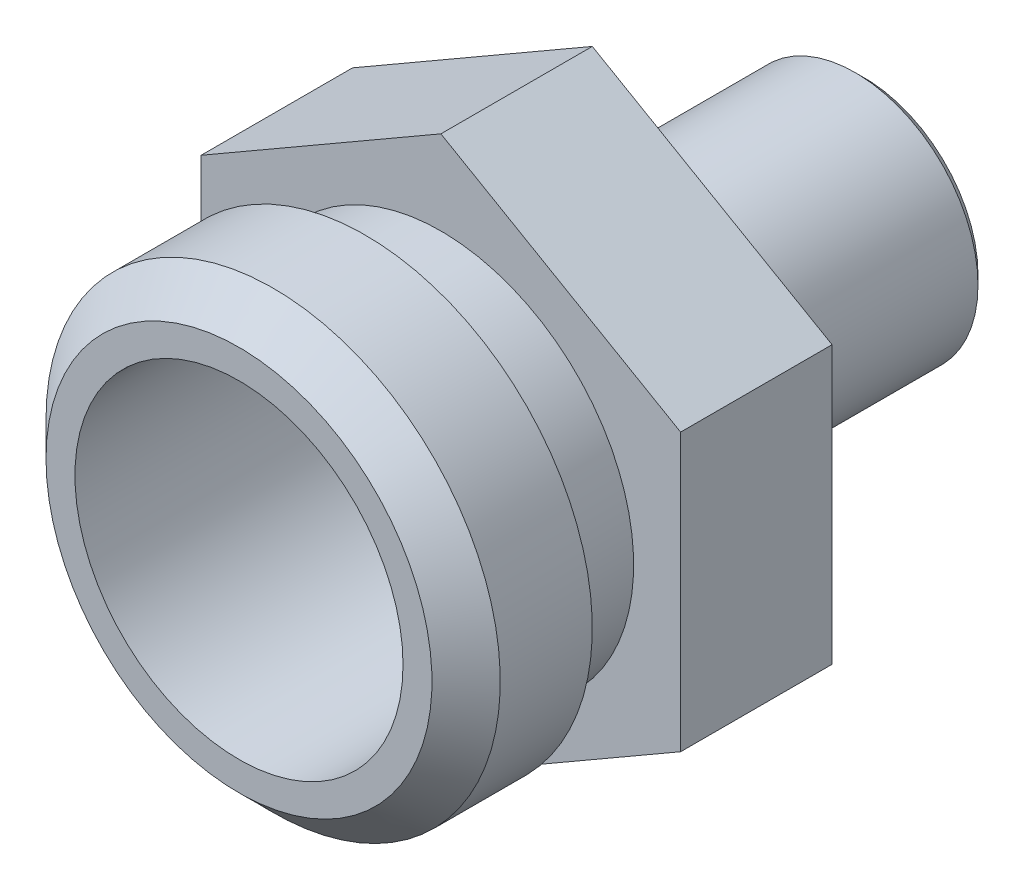
ISO-10303-21;
HEADER;
FILE_DESCRIPTION(('STEP AP214'),'2;1');
FILE_NAME('part.step','',(''),(''),'','','');
FILE_SCHEMA(('AUTOMOTIVE_DESIGN { 1 0 10303 214 1 1 1 1 }'));
ENDSEC;
DATA;
#1=APPLICATION_CONTEXT('core data for automotive mechanical design processes');
#2=APPLICATION_PROTOCOL_DEFINITION('international standard','automotive_design',2000,#1);
#3=PRODUCT_CONTEXT('',#1,'mechanical');
#4=PRODUCT('Part','Part','',(#3));
#5=PRODUCT_RELATED_PRODUCT_CATEGORY('part','',(#4));
#6=PRODUCT_DEFINITION_FORMATION('','',#4);
#7=PRODUCT_DEFINITION_CONTEXT('part definition',#1,'design');
#8=PRODUCT_DEFINITION('design','',#6,#7);
#9=PRODUCT_DEFINITION_SHAPE('','',#8);
#10=(LENGTH_UNIT() NAMED_UNIT(*) SI_UNIT(.MILLI.,.METRE.));
#11=(NAMED_UNIT(*) PLANE_ANGLE_UNIT() SI_UNIT($,.RADIAN.));
#12=(NAMED_UNIT(*) SI_UNIT($,.STERADIAN.) SOLID_ANGLE_UNIT());
#13=UNCERTAINTY_MEASURE_WITH_UNIT(LENGTH_MEASURE(1.E-05),#10,'distance_accuracy_value','');
#14=(GEOMETRIC_REPRESENTATION_CONTEXT(3) GLOBAL_UNCERTAINTY_ASSIGNED_CONTEXT((#13)) GLOBAL_UNIT_ASSIGNED_CONTEXT((#10,
#11,#12)) REPRESENTATION_CONTEXT('',''));
#15=CARTESIAN_POINT('',(0.,0.,0.));
#16=DIRECTION('',(0.,0.,1.));
#17=DIRECTION('',(1.,0.,0.));
#18=AXIS2_PLACEMENT_3D('',#15,#16,#17);
#19=CARTESIAN_POINT('',(-9.49999999999999,5.48482755730145,-14.));
#20=DIRECTION('',(0.5,-0.866025403784439,0.));
#21=DIRECTION('',(0.866025403784439,0.5,0.));
#22=AXIS2_PLACEMENT_3D('',#19,#20,#21);
#23=PLANE('',#22);
#24=DIRECTION('',(0.866025403784439,0.5,0.));
#25=VECTOR('',#24,1.);
#26=CARTESIAN_POINT('',(-9.49999999999999,5.48482755730145,-8.));
#27=LINE('',#26,#25);
#28=CARTESIAN_POINT('',(-9.49999999999999,5.48482755730145,-8.));
#29=VERTEX_POINT('',#28);
#30=CARTESIAN_POINT('',(0.,10.9696551146029,-8.));
#31=VERTEX_POINT('',#30);
#32=EDGE_CURVE('E134',#29,#31,#27,.T.);
#33=ORIENTED_EDGE('',*,*,#32,.T.);
#34=DIRECTION('',(0.,0.,1.));
#35=VECTOR('',#34,1.);
#36=CARTESIAN_POINT('',(0.,10.9696551146029,-14.));
#37=LINE('',#36,#35);
#38=CARTESIAN_POINT('',(0.,10.9696551146029,-14.));
#39=VERTEX_POINT('',#38);
#40=EDGE_CURVE('E12',#39,#31,#37,.T.);
#41=ORIENTED_EDGE('',*,*,#40,.F.);
#42=DIRECTION('',(0.866025403784439,0.5,0.));
#43=VECTOR('',#42,1.);
#44=CARTESIAN_POINT('',(-9.49999999999999,5.48482755730145,-14.));
#45=LINE('',#44,#43);
#46=CARTESIAN_POINT('',(-9.49999999999999,5.48482755730145,-14.));
#47=VERTEX_POINT('',#46);
#48=EDGE_CURVE('E145',#47,#39,#45,.T.);
#49=ORIENTED_EDGE('',*,*,#48,.F.);
#50=DIRECTION('',(0.,0.,1.));
#51=VECTOR('',#50,1.);
#52=CARTESIAN_POINT('',(-9.49999999999999,5.48482755730145,-14.));
#53=LINE('',#52,#51);
#54=EDGE_CURVE('E130',#47,#29,#53,.T.);
#55=ORIENTED_EDGE('',*,*,#54,.T.);
#56=EDGE_LOOP('',(#33,#41,#49,#55));
#57=FACE_BOUND('',#56,.T.);
#58=ADVANCED_FACE('F47',(#57),#23,.F.);
#59=CARTESIAN_POINT('',(0.,10.9696551146029,-14.));
#60=DIRECTION('',(-0.5,-0.866025403784439,0.));
#61=DIRECTION('',(0.866025403784439,-0.5,0.));
#62=AXIS2_PLACEMENT_3D('',#59,#60,#61);
#63=PLANE('',#62);
#64=DIRECTION('',(0.866025403784439,-0.5,0.));
#65=VECTOR('',#64,1.);
#66=CARTESIAN_POINT('',(0.,10.9696551146029,-8.));
#67=LINE('',#66,#65);
#68=CARTESIAN_POINT('',(9.50000000000001,5.48482755730145,-8.));
#69=VERTEX_POINT('',#68);
#70=EDGE_CURVE('E137',#31,#69,#67,.T.);
#71=ORIENTED_EDGE('',*,*,#70,.T.);
#72=DIRECTION('',(0.,0.,1.));
#73=VECTOR('',#72,1.);
#74=CARTESIAN_POINT('',(9.50000000000001,5.48482755730145,-14.));
#75=LINE('',#74,#73);
#76=CARTESIAN_POINT('',(9.50000000000001,5.48482755730145,-14.));
#77=VERTEX_POINT('',#76);
#78=EDGE_CURVE('E57',#77,#69,#75,.T.);
#79=ORIENTED_EDGE('',*,*,#78,.F.);
#80=DIRECTION('',(0.866025403784439,-0.5,0.));
#81=VECTOR('',#80,1.);
#82=CARTESIAN_POINT('',(0.,10.9696551146029,-14.));
#83=LINE('',#82,#81);
#84=EDGE_CURVE('E102',#39,#77,#83,.T.);
#85=ORIENTED_EDGE('',*,*,#84,.F.);
#86=ORIENTED_EDGE('',*,*,#40,.T.);
#87=EDGE_LOOP('',(#71,#79,#85,#86));
#88=FACE_BOUND('',#87,.T.);
#89=ADVANCED_FACE('F172',(#88),#63,.F.);
#90=CARTESIAN_POINT('',(9.50000000000001,5.48482755730145,-14.));
#91=DIRECTION('',(-1.,0.,0.));
#92=DIRECTION('',(0.,-1.,0.));
#93=AXIS2_PLACEMENT_3D('',#90,#91,#92);
#94=PLANE('',#93);
#95=DIRECTION('',(0.,-1.,0.));
#96=VECTOR('',#95,1.);
#97=CARTESIAN_POINT('',(9.50000000000001,5.48482755730145,-8.));
#98=LINE('',#97,#96);
#99=CARTESIAN_POINT('',(9.50000000000001,-5.48482755730145,-8.));
#100=VERTEX_POINT('',#99);
#101=EDGE_CURVE('E140',#69,#100,#98,.T.);
#102=ORIENTED_EDGE('',*,*,#101,.T.);
#103=DIRECTION('',(0.,0.,1.));
#104=VECTOR('',#103,1.);
#105=CARTESIAN_POINT('',(9.50000000000001,-5.48482755730145,-14.));
#106=LINE('',#105,#104);
#107=CARTESIAN_POINT('',(9.50000000000001,-5.48482755730145,-14.));
#108=VERTEX_POINT('',#107);
#109=EDGE_CURVE('E125',#108,#100,#106,.T.);
#110=ORIENTED_EDGE('',*,*,#109,.F.);
#111=DIRECTION('',(0.,-1.,0.));
#112=VECTOR('',#111,1.);
#113=CARTESIAN_POINT('',(9.50000000000001,5.48482755730145,-14.));
#114=LINE('',#113,#112);
#115=EDGE_CURVE('E116',#77,#108,#114,.T.);
#116=ORIENTED_EDGE('',*,*,#115,.F.);
#117=ORIENTED_EDGE('',*,*,#78,.T.);
#118=EDGE_LOOP('',(#102,#110,#116,#117));
#119=FACE_BOUND('',#118,.T.);
#120=ADVANCED_FACE('F152',(#119),#94,.F.);
#121=CARTESIAN_POINT('',(9.50000000000001,-5.48482755730145,-14.));
#122=DIRECTION('',(-0.5,0.866025403784438,0.));
#123=DIRECTION('',(-0.866025403784439,-0.5,0.));
#124=AXIS2_PLACEMENT_3D('',#121,#122,#123);
#125=PLANE('',#124);
#126=DIRECTION('',(-0.866025403784438,-0.5,0.));
#127=VECTOR('',#126,1.);
#128=CARTESIAN_POINT('',(9.50000000000001,-5.48482755730145,-8.));
#129=LINE('',#128,#127);
#130=CARTESIAN_POINT('',(0.,-10.9696551146029,-8.));
#131=VERTEX_POINT('',#130);
#132=EDGE_CURVE('E124',#100,#131,#129,.T.);
#133=ORIENTED_EDGE('',*,*,#132,.T.);
#134=DIRECTION('',(0.,0.,1.));
#135=VECTOR('',#134,1.);
#136=CARTESIAN_POINT('',(0.,-10.9696551146029,-14.));
#137=LINE('',#136,#135);
#138=CARTESIAN_POINT('',(0.,-10.9696551146029,-14.));
#139=VERTEX_POINT('',#138);
#140=EDGE_CURVE('E121',#139,#131,#137,.T.);
#141=ORIENTED_EDGE('',*,*,#140,.F.);
#142=DIRECTION('',(-0.866025403784438,-0.5,0.));
#143=VECTOR('',#142,1.);
#144=CARTESIAN_POINT('',(9.50000000000001,-5.48482755730145,-14.));
#145=LINE('',#144,#143);
#146=EDGE_CURVE('E109',#108,#139,#145,.T.);
#147=ORIENTED_EDGE('',*,*,#146,.F.);
#148=ORIENTED_EDGE('',*,*,#109,.T.);
#149=EDGE_LOOP('',(#133,#141,#147,#148));
#150=FACE_BOUND('',#149,.T.);
#151=ADVANCED_FACE('F122',(#150),#125,.F.);
#152=CARTESIAN_POINT('',(0.,-10.9696551146029,-14.));
#153=DIRECTION('',(0.5,0.866025403784439,0.));
#154=DIRECTION('',(-0.866025403784439,0.5,0.));
#155=AXIS2_PLACEMENT_3D('',#152,#153,#154);
#156=PLANE('',#155);
#157=DIRECTION('',(-0.866025403784439,0.5,0.));
#158=VECTOR('',#157,1.);
#159=CARTESIAN_POINT('',(0.,-10.9696551146029,-8.));
#160=LINE('',#159,#158);
#161=CARTESIAN_POINT('',(-9.49999999999999,-5.48482755730145,-8.));
#162=VERTEX_POINT('',#161);
#163=EDGE_CURVE('E88',#131,#162,#160,.T.);
#164=ORIENTED_EDGE('',*,*,#163,.T.);
#165=DIRECTION('',(0.,0.,1.));
#166=VECTOR('',#165,1.);
#167=CARTESIAN_POINT('',(-9.49999999999999,-5.48482755730145,-14.));
#168=LINE('',#167,#166);
#169=CARTESIAN_POINT('',(-9.49999999999999,-5.48482755730145,-14.));
#170=VERTEX_POINT('',#169);
#171=EDGE_CURVE('E126',#170,#162,#168,.T.);
#172=ORIENTED_EDGE('',*,*,#171,.F.);
#173=DIRECTION('',(-0.866025403784439,0.5,0.));
#174=VECTOR('',#173,1.);
#175=CARTESIAN_POINT('',(0.,-10.9696551146029,-14.));
#176=LINE('',#175,#174);
#177=EDGE_CURVE('E114',#139,#170,#176,.T.);
#178=ORIENTED_EDGE('',*,*,#177,.F.);
#179=ORIENTED_EDGE('',*,*,#140,.T.);
#180=EDGE_LOOP('',(#164,#172,#178,#179));
#181=FACE_BOUND('',#180,.T.);
#182=ADVANCED_FACE('F128',(#181),#156,.F.);
#183=CARTESIAN_POINT('',(-9.49999999999999,-5.48482755730145,-14.));
#184=DIRECTION('',(1.,0.,0.));
#185=DIRECTION('',(0.,0.,-1.));
#186=AXIS2_PLACEMENT_3D('',#183,#184,#185);
#187=PLANE('',#186);
#188=DIRECTION('',(0.,1.,0.));
#189=VECTOR('',#188,1.);
#190=CARTESIAN_POINT('',(-9.49999999999999,-5.48482755730145,-8.));
#191=LINE('',#190,#189);
#192=EDGE_CURVE('E94',#162,#29,#191,.T.);
#193=ORIENTED_EDGE('',*,*,#192,.T.);
#194=ORIENTED_EDGE('',*,*,#54,.F.);
#195=DIRECTION('',(0.,1.,0.));
#196=VECTOR('',#195,1.);
#197=CARTESIAN_POINT('',(-9.49999999999999,-5.48482755730145,-14.));
#198=LINE('',#197,#196);
#199=EDGE_CURVE('E65',#170,#47,#198,.T.);
#200=ORIENTED_EDGE('',*,*,#199,.F.);
#201=ORIENTED_EDGE('',*,*,#171,.T.);
#202=EDGE_LOOP('',(#193,#194,#200,#201));
#203=FACE_BOUND('',#202,.T.);
#204=ADVANCED_FACE('F160',(#203),#187,.F.);
#205=CARTESIAN_POINT('',(0.,0.,-14.));
#206=DIRECTION('',(0.,0.,-1.));
#207=DIRECTION('',(-1.,0.,0.));
#208=AXIS2_PLACEMENT_3D('',#205,#206,#207);
#209=PLANE('',#208);
#210=ORIENTED_EDGE('',*,*,#48,.T.);
#211=ORIENTED_EDGE('',*,*,#84,.T.);
#212=ORIENTED_EDGE('',*,*,#115,.T.);
#213=ORIENTED_EDGE('',*,*,#146,.T.);
#214=ORIENTED_EDGE('',*,*,#177,.T.);
#215=ORIENTED_EDGE('',*,*,#199,.T.);
#216=EDGE_LOOP('',(#210,#211,#212,#213,#214,#215));
#217=FACE_BOUND('',#216,.T.);
#218=CARTESIAN_POINT('',(0.,0.,-14.));
#219=DIRECTION('',(0.,0.,1.));
#220=DIRECTION('',(1.,0.,0.));
#221=AXIS2_PLACEMENT_3D('',#218,#219,#220);
#222=CIRCLE('',#221,4.864);
#223=CARTESIAN_POINT('',(4.864,0.,-14.));
#224=VERTEX_POINT('',#223);
#225=EDGE_CURVE('E202',#224,#224,#222,.T.);
#226=ORIENTED_EDGE('',*,*,#225,.T.);
#227=EDGE_LOOP('',(#226));
#228=FACE_BOUND('',#227,.T.);
#229=ADVANCED_FACE('F111',(#217,#228),#209,.T.);
#230=CARTESIAN_POINT('',(0.,0.,-8.));
#231=DIRECTION('',(0.,0.,-1.));
#232=DIRECTION('',(-1.,0.,0.));
#233=AXIS2_PLACEMENT_3D('',#230,#231,#232);
#234=PLANE('',#233);
#235=ORIENTED_EDGE('',*,*,#32,.F.);
#236=ORIENTED_EDGE('',*,*,#192,.F.);
#237=ORIENTED_EDGE('',*,*,#163,.F.);
#238=ORIENTED_EDGE('',*,*,#132,.F.);
#239=ORIENTED_EDGE('',*,*,#101,.F.);
#240=ORIENTED_EDGE('',*,*,#70,.F.);
#241=EDGE_LOOP('',(#235,#236,#237,#238,#239,#240));
#242=FACE_BOUND('',#241,.T.);
#243=CARTESIAN_POINT('',(0.,0.,-8.));
#244=DIRECTION('',(0.,0.,-1.));
#245=DIRECTION('',(-1.,0.,0.));
#246=AXIS2_PLACEMENT_3D('',#243,#244,#245);
#247=CIRCLE('',#246,7.63865023191384);
#248=CARTESIAN_POINT('',(-7.63865023191384,0.,-8.));
#249=VERTEX_POINT('',#248);
#250=EDGE_CURVE('E224',#249,#249,#247,.T.);
#251=ORIENTED_EDGE('',*,*,#250,.T.);
#252=EDGE_LOOP('',(#251));
#253=FACE_BOUND('',#252,.T.);
#254=ADVANCED_FACE('F155',(#242,#253),#234,.F.);
#255=CARTESIAN_POINT('',(0.,0.,-25.));
#256=DIRECTION('',(0.,0.,1.));
#257=DIRECTION('',(1.,0.,0.));
#258=AXIS2_PLACEMENT_3D('',#255,#256,#257);
#259=CYLINDRICAL_SURFACE('',#258,4.864);
#260=ORIENTED_EDGE('',*,*,#225,.F.);
#261=EDGE_LOOP('',(#260));
#262=FACE_BOUND('',#261,.T.);
#263=CARTESIAN_POINT('',(0.,0.,-24.419));
#264=DIRECTION('',(0.,0.,1.));
#265=DIRECTION('',(1.,0.,0.));
#266=AXIS2_PLACEMENT_3D('',#263,#264,#265);
#267=CIRCLE('',#266,4.864);
#268=CARTESIAN_POINT('',(4.864,0.,-24.419));
#269=VERTEX_POINT('',#268);
#270=EDGE_CURVE('E207',#269,#269,#267,.T.);
#271=ORIENTED_EDGE('',*,*,#270,.T.);
#272=EDGE_LOOP('',(#271));
#273=FACE_BOUND('',#272,.T.);
#274=ADVANCED_FACE('F255',(#262,#273),#259,.T.);
#275=CARTESIAN_POINT('',(0.,0.,-25.));
#276=DIRECTION('',(0.,0.,1.));
#277=DIRECTION('',(1.,0.,0.));
#278=AXIS2_PLACEMENT_3D('',#275,#276,#277);
#279=CONICAL_SURFACE('',#278,4.283,0.785398163397455);
#280=CARTESIAN_POINT('',(0.,0.,-24.783));
#281=DIRECTION('',(0.,0.,1.));
#282=DIRECTION('',(1.,0.,0.));
#283=AXIS2_PLACEMENT_3D('',#280,#281,#282);
#284=CIRCLE('',#283,4.5);
#285=CARTESIAN_POINT('',(4.5,0.,-24.783));
#286=VERTEX_POINT('',#285);
#287=EDGE_CURVE('E227',#286,#286,#284,.T.);
#288=ORIENTED_EDGE('',*,*,#287,.T.);
#289=EDGE_LOOP('',(#288));
#290=FACE_BOUND('',#289,.T.);
#291=ORIENTED_EDGE('',*,*,#270,.F.);
#292=EDGE_LOOP('',(#291));
#293=FACE_BOUND('',#292,.T.);
#294=ADVANCED_FACE('F253',(#290,#293),#279,.T.);
#295=CARTESIAN_POINT('',(0.,0.,-7.32685608512492));
#296=DIRECTION('',(0.,0.,-1.));
#297=DIRECTION('',(-1.,0.,0.));
#298=AXIS2_PLACEMENT_3D('',#295,#296,#297);
#299=CYLINDRICAL_SURFACE('',#298,7.63865023191384);
#300=CARTESIAN_POINT('',(0.,0.,-5.));
#301=DIRECTION('',(0.,0.,-1.));
#302=DIRECTION('',(-1.,0.,0.));
#303=AXIS2_PLACEMENT_3D('',#300,#301,#302);
#304=CIRCLE('',#303,7.63865023191384);
#305=CARTESIAN_POINT('',(-7.63865023191384,0.,-5.));
#306=VERTEX_POINT('',#305);
#307=EDGE_CURVE('E216',#306,#306,#304,.T.);
#308=ORIENTED_EDGE('',*,*,#307,.T.);
#309=EDGE_LOOP('',(#308));
#310=FACE_BOUND('',#309,.T.);
#311=ORIENTED_EDGE('',*,*,#250,.F.);
#312=EDGE_LOOP('',(#311));
#313=FACE_BOUND('',#312,.T.);
#314=ADVANCED_FACE('F248',(#310,#313),#299,.T.);
#315=CARTESIAN_POINT('',(7.63865023191384,0.,-5.));
#316=DIRECTION('',(0.,0.,-1.));
#317=DIRECTION('',(-1.,0.,0.));
#318=AXIS2_PLACEMENT_3D('',#315,#316,#317);
#319=PLANE('',#318);
#320=CARTESIAN_POINT('',(0.,0.,-5.));
#321=DIRECTION('',(0.,0.,-1.));
#322=DIRECTION('',(-1.,0.,0.));
#323=AXIS2_PLACEMENT_3D('',#320,#321,#322);
#324=CIRCLE('',#323,9.);
#325=CARTESIAN_POINT('',(-9.,0.,-5.));
#326=VERTEX_POINT('',#325);
#327=EDGE_CURVE('E221',#326,#326,#324,.T.);
#328=ORIENTED_EDGE('',*,*,#327,.T.);
#329=EDGE_LOOP('',(#328));
#330=FACE_BOUND('',#329,.T.);
#331=ORIENTED_EDGE('',*,*,#307,.F.);
#332=EDGE_LOOP('',(#331));
#333=FACE_BOUND('',#332,.T.);
#334=ADVANCED_FACE('F239',(#330,#333),#319,.T.);
#335=CARTESIAN_POINT('',(0.,0.,-11.));
#336=DIRECTION('',(0.,0.,1.));
#337=DIRECTION('',(1.,0.,0.));
#338=AXIS2_PLACEMENT_3D('',#335,#336,#337);
#339=PLANE('',#338);
#340=CARTESIAN_POINT('',(0.,0.,-11.));
#341=DIRECTION('',(0.,0.,1.));
#342=DIRECTION('',(1.,0.,0.));
#343=AXIS2_PLACEMENT_3D('',#340,#341,#342);
#344=CIRCLE('',#343,4.5);
#345=CARTESIAN_POINT('',(4.5,0.,-11.));
#346=VERTEX_POINT('',#345);
#347=EDGE_CURVE('E51',#346,#346,#344,.T.);
#348=ORIENTED_EDGE('',*,*,#347,.F.);
#349=EDGE_LOOP('',(#348));
#350=FACE_BOUND('',#349,.T.);
#351=CARTESIAN_POINT('',(0.,0.,-11.));
#352=DIRECTION('',(0.,0.,1.));
#353=DIRECTION('',(1.,0.,0.));
#354=AXIS2_PLACEMENT_3D('',#351,#352,#353);
#355=CIRCLE('',#354,6.5);
#356=CARTESIAN_POINT('',(6.5,0.,-11.));
#357=VERTEX_POINT('',#356);
#358=EDGE_CURVE('E214',#357,#357,#355,.T.);
#359=ORIENTED_EDGE('',*,*,#358,.T.);
#360=EDGE_LOOP('',(#359));
#361=FACE_BOUND('',#360,.T.);
#362=ADVANCED_FACE('F191',(#350,#361),#339,.T.);
#363=CARTESIAN_POINT('',(0.,0.,-11.));
#364=DIRECTION('',(0.,0.,1.));
#365=DIRECTION('',(1.,0.,0.));
#366=AXIS2_PLACEMENT_3D('',#363,#364,#365);
#367=CYLINDRICAL_SURFACE('',#366,6.5);
#368=ORIENTED_EDGE('',*,*,#358,.F.);
#369=EDGE_LOOP('',(#368));
#370=FACE_BOUND('',#369,.T.);
#371=CARTESIAN_POINT('',(0.,0.,0.));
#372=DIRECTION('',(0.,0.,1.));
#373=DIRECTION('',(1.,0.,0.));
#374=AXIS2_PLACEMENT_3D('',#371,#372,#373);
#375=CIRCLE('',#374,6.5);
#376=CARTESIAN_POINT('',(6.5,0.,0.));
#377=VERTEX_POINT('',#376);
#378=EDGE_CURVE('E197',#377,#377,#375,.T.);
#379=ORIENTED_EDGE('',*,*,#378,.T.);
#380=EDGE_LOOP('',(#379));
#381=FACE_BOUND('',#380,.T.);
#382=ADVANCED_FACE('F182',(#370,#381),#367,.F.);
#383=CARTESIAN_POINT('',(0.,0.,0.));
#384=DIRECTION('',(0.,0.,1.));
#385=DIRECTION('',(1.,0.,0.));
#386=AXIS2_PLACEMENT_3D('',#383,#384,#385);
#387=PLANE('',#386);
#388=ORIENTED_EDGE('',*,*,#378,.F.);
#389=EDGE_LOOP('',(#388));
#390=FACE_BOUND('',#389,.T.);
#391=CARTESIAN_POINT('',(0.,0.,0.));
#392=DIRECTION('',(0.,0.,-1.));
#393=DIRECTION('',(-1.,0.,0.));
#394=AXIS2_PLACEMENT_3D('',#391,#392,#393);
#395=CIRCLE('',#394,7.647);
#396=CARTESIAN_POINT('',(-7.647,0.,0.));
#397=VERTEX_POINT('',#396);
#398=EDGE_CURVE('E200',#397,#397,#395,.T.);
#399=ORIENTED_EDGE('',*,*,#398,.F.);
#400=EDGE_LOOP('',(#399));
#401=FACE_BOUND('',#400,.T.);
#402=ADVANCED_FACE('F179',(#390,#401),#387,.T.);
#403=CARTESIAN_POINT('',(0.,0.,0.));
#404=DIRECTION('',(0.,0.,-1.));
#405=DIRECTION('',(-1.,0.,0.));
#406=AXIS2_PLACEMENT_3D('',#403,#404,#405);
#407=CONICAL_SURFACE('',#406,7.647,0.785398163397456);
#408=CARTESIAN_POINT('',(0.,0.,-1.35299999999998));
#409=DIRECTION('',(0.,0.,-1.));
#410=DIRECTION('',(-1.,0.,0.));
#411=AXIS2_PLACEMENT_3D('',#408,#409,#410);
#412=CIRCLE('',#411,9.);
#413=CARTESIAN_POINT('',(-9.,0.,-1.35299999999998));
#414=VERTEX_POINT('',#413);
#415=EDGE_CURVE('E138',#414,#414,#412,.T.);
#416=ORIENTED_EDGE('',*,*,#415,.F.);
#417=EDGE_LOOP('',(#416));
#418=FACE_BOUND('',#417,.T.);
#419=ORIENTED_EDGE('',*,*,#398,.T.);
#420=EDGE_LOOP('',(#419));
#421=FACE_BOUND('',#420,.T.);
#422=ADVANCED_FACE('F181',(#418,#421),#407,.T.);
#423=CARTESIAN_POINT('',(0.,0.,-8.));
#424=DIRECTION('',(0.,0.,1.));
#425=DIRECTION('',(1.,0.,0.));
#426=AXIS2_PLACEMENT_3D('',#423,#424,#425);
#427=CYLINDRICAL_SURFACE('',#426,9.);
#428=ORIENTED_EDGE('',*,*,#415,.T.);
#429=EDGE_LOOP('',(#428));
#430=FACE_BOUND('',#429,.T.);
#431=ORIENTED_EDGE('',*,*,#327,.F.);
#432=EDGE_LOOP('',(#431));
#433=FACE_BOUND('',#432,.T.);
#434=ADVANCED_FACE('F49',(#430,#433),#427,.T.);
#435=CARTESIAN_POINT('',(0.,0.,0.));
#436=DIRECTION('',(0.,0.,-1.));
#437=DIRECTION('',(-1.,0.,0.));
#438=AXIS2_PLACEMENT_3D('',#435,#436,#437);
#439=CYLINDRICAL_SURFACE('',#438,4.5);
#440=ORIENTED_EDGE('',*,*,#347,.T.);
#441=EDGE_LOOP('',(#440));
#442=FACE_BOUND('',#441,.T.);
#443=ORIENTED_EDGE('',*,*,#287,.F.);
#444=EDGE_LOOP('',(#443));
#445=FACE_BOUND('',#444,.T.);
#446=ADVANCED_FACE('F234',(#442,#445),#439,.F.);
#447=CLOSED_SHELL('',(#58,#89,#120,#151,#182,#204,#229,#254,#274,#294,#314,#334,#362,#382,#402,
#422,#434,#446));
#448=MANIFOLD_SOLID_BREP('B2',#447);
#449=ADVANCED_BREP_SHAPE_REPRESENTATION('',(#18,#448),#14);
#450=SHAPE_DEFINITION_REPRESENTATION(#9,#449);
ENDSEC;
END-ISO-10303-21;
